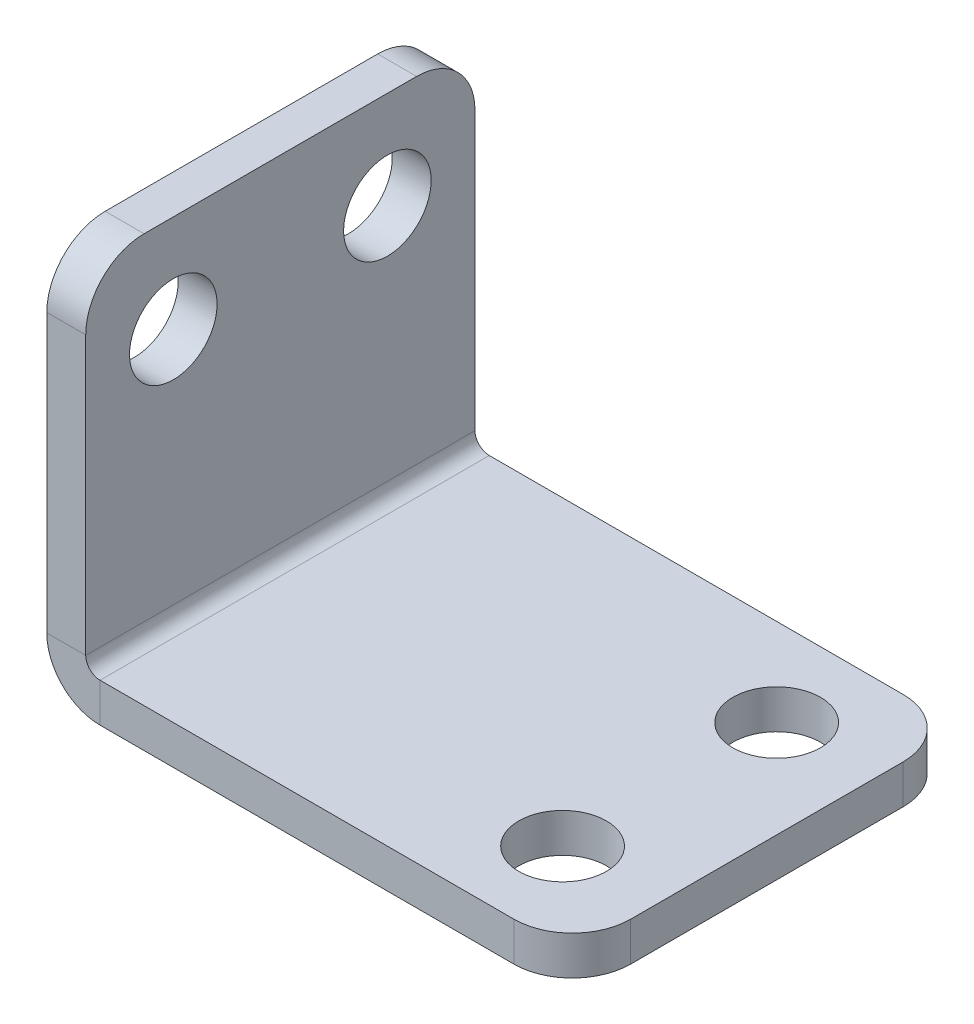
ISO-10303-21;
HEADER;
FILE_DESCRIPTION(('STEP AP214'),'2;1');
FILE_NAME('part.step','',(''),(''),'','','');
FILE_SCHEMA(('AUTOMOTIVE_DESIGN { 1 0 10303 214 1 1 1 1 }'));
ENDSEC;
DATA;
#1=APPLICATION_CONTEXT('core data for automotive mechanical design processes');
#2=APPLICATION_PROTOCOL_DEFINITION('international standard','automotive_design',2000,#1);
#3=PRODUCT_CONTEXT('',#1,'mechanical');
#4=PRODUCT('Part','Part','',(#3));
#5=PRODUCT_RELATED_PRODUCT_CATEGORY('part','',(#4));
#6=PRODUCT_DEFINITION_FORMATION('','',#4);
#7=PRODUCT_DEFINITION_CONTEXT('part definition',#1,'design');
#8=PRODUCT_DEFINITION('design','',#6,#7);
#9=PRODUCT_DEFINITION_SHAPE('','',#8);
#10=(LENGTH_UNIT() NAMED_UNIT(*) SI_UNIT(.MILLI.,.METRE.));
#11=(NAMED_UNIT(*) PLANE_ANGLE_UNIT() SI_UNIT($,.RADIAN.));
#12=(NAMED_UNIT(*) SI_UNIT($,.STERADIAN.) SOLID_ANGLE_UNIT());
#13=UNCERTAINTY_MEASURE_WITH_UNIT(LENGTH_MEASURE(1.E-05),#10,'distance_accuracy_value','');
#14=(GEOMETRIC_REPRESENTATION_CONTEXT(3) GLOBAL_UNCERTAINTY_ASSIGNED_CONTEXT((#13)) GLOBAL_UNIT_ASSIGNED_CONTEXT((#10,
#11,#12)) REPRESENTATION_CONTEXT('',''));
#15=CARTESIAN_POINT('',(0.,0.,0.));
#16=DIRECTION('',(0.,0.,1.));
#17=DIRECTION('',(1.,0.,0.));
#18=AXIS2_PLACEMENT_3D('',#15,#16,#17);
#19=CARTESIAN_POINT('',(0.,2.7366,10.));
#20=DIRECTION('',(0.,0.,1.));
#21=DIRECTION('',(1.,0.,0.));
#22=AXIS2_PLACEMENT_3D('',#19,#20,#21);
#23=PLANE('',#22);
#24=DIRECTION('',(1.,0.,0.));
#25=VECTOR('',#24,1.);
#26=CARTESIAN_POINT('',(0.,2.7366,10.));
#27=LINE('',#26,#25);
#28=CARTESIAN_POINT('',(0.,2.7366,10.));
#29=VERTEX_POINT('',#28);
#30=CARTESIAN_POINT('',(2.,2.7366,10.));
#31=VERTEX_POINT('',#30);
#32=EDGE_CURVE('E135',#29,#31,#27,.T.);
#33=ORIENTED_EDGE('',*,*,#32,.F.);
#34=CARTESIAN_POINT('',(2.7366,2.7366,10.));
#35=DIRECTION('',(0.,0.,-1.));
#36=DIRECTION('',(-1.,0.,0.));
#37=AXIS2_PLACEMENT_3D('',#34,#35,#36);
#38=CIRCLE('',#37,2.7366);
#39=CARTESIAN_POINT('',(2.7366,0.,10.));
#40=VERTEX_POINT('',#39);
#41=EDGE_CURVE('E133',#29,#40,#38,.F.);
#42=ORIENTED_EDGE('',*,*,#41,.T.);
#43=DIRECTION('',(0.,-1.,0.));
#44=VECTOR('',#43,1.);
#45=CARTESIAN_POINT('',(2.7366,2.,10.));
#46=LINE('',#45,#44);
#47=CARTESIAN_POINT('',(2.7366,2.,10.));
#48=VERTEX_POINT('',#47);
#49=EDGE_CURVE('E127',#48,#40,#46,.T.);
#50=ORIENTED_EDGE('',*,*,#49,.F.);
#51=CARTESIAN_POINT('',(2.7366,2.7366,10.));
#52=DIRECTION('',(0.,0.,1.));
#53=DIRECTION('',(1.,0.,0.));
#54=AXIS2_PLACEMENT_3D('',#51,#52,#53);
#55=CIRCLE('',#54,0.7366);
#56=EDGE_CURVE('E131',#31,#48,#55,.T.);
#57=ORIENTED_EDGE('',*,*,#56,.F.);
#58=EDGE_LOOP('',(#33,#42,#50,#57));
#59=FACE_BOUND('',#58,.T.);
#60=ADVANCED_FACE('F34',(#59),#23,.T.);
#61=CARTESIAN_POINT('',(2.7366,2.,10.));
#62=DIRECTION('',(0.,0.,1.));
#63=DIRECTION('',(1.,0.,0.));
#64=AXIS2_PLACEMENT_3D('',#61,#62,#63);
#65=PLANE('',#64);
#66=DIRECTION('',(0.,-1.,0.));
#67=VECTOR('',#66,1.);
#68=CARTESIAN_POINT('',(2.,20.,10.));
#69=LINE('',#68,#67);
#70=CARTESIAN_POINT('',(2.,17.,10.));
#71=VERTEX_POINT('',#70);
#72=EDGE_CURVE('E156',#71,#31,#69,.T.);
#73=ORIENTED_EDGE('',*,*,#72,.F.);
#74=DIRECTION('',(1.,0.,0.));
#75=VECTOR('',#74,1.);
#76=CARTESIAN_POINT('',(2.7366,17.,10.));
#77=LINE('',#76,#75);
#78=CARTESIAN_POINT('',(0.,17.,10.));
#79=VERTEX_POINT('',#78);
#80=EDGE_CURVE('E210',#71,#79,#77,.F.);
#81=ORIENTED_EDGE('',*,*,#80,.T.);
#82=DIRECTION('',(0.,-1.,0.));
#83=VECTOR('',#82,1.);
#84=CARTESIAN_POINT('',(0.,20.,10.));
#85=LINE('',#84,#83);
#86=EDGE_CURVE('E158',#79,#29,#85,.T.);
#87=ORIENTED_EDGE('',*,*,#86,.T.);
#88=ORIENTED_EDGE('',*,*,#32,.T.);
#89=EDGE_LOOP('',(#73,#81,#87,#88));
#90=FACE_BOUND('',#89,.T.);
#91=ADVANCED_FACE('F292',(#90),#65,.T.);
#92=CARTESIAN_POINT('',(2.7366,0.,-10.));
#93=DIRECTION('',(0.,0.,-1.));
#94=DIRECTION('',(-1.,0.,0.));
#95=AXIS2_PLACEMENT_3D('',#92,#93,#94);
#96=PLANE('',#95);
#97=DIRECTION('',(0.,1.,0.));
#98=VECTOR('',#97,1.);
#99=CARTESIAN_POINT('',(2.7366,0.,-10.));
#100=LINE('',#99,#98);
#101=CARTESIAN_POINT('',(2.7366,0.,-10.));
#102=VERTEX_POINT('',#101);
#103=CARTESIAN_POINT('',(2.7366,2.,-10.));
#104=VERTEX_POINT('',#103);
#105=EDGE_CURVE('E136',#102,#104,#100,.T.);
#106=ORIENTED_EDGE('',*,*,#105,.F.);
#107=CARTESIAN_POINT('',(2.7366,2.7366,-10.));
#108=DIRECTION('',(0.,0.,-1.));
#109=DIRECTION('',(-1.,0.,0.));
#110=AXIS2_PLACEMENT_3D('',#107,#108,#109);
#111=CIRCLE('',#110,2.7366);
#112=CARTESIAN_POINT('',(0.,2.7366,-10.));
#113=VERTEX_POINT('',#112);
#114=EDGE_CURVE('E176',#113,#102,#111,.F.);
#115=ORIENTED_EDGE('',*,*,#114,.F.);
#116=DIRECTION('',(-1.,0.,0.));
#117=VECTOR('',#116,1.);
#118=CARTESIAN_POINT('',(2.,2.7366,-10.));
#119=LINE('',#118,#117);
#120=CARTESIAN_POINT('',(2.,2.7366,-10.));
#121=VERTEX_POINT('',#120);
#122=EDGE_CURVE('E195',#121,#113,#119,.T.);
#123=ORIENTED_EDGE('',*,*,#122,.F.);
#124=CARTESIAN_POINT('',(2.7366,2.7366,-10.));
#125=DIRECTION('',(0.,0.,1.));
#126=DIRECTION('',(1.,0.,0.));
#127=AXIS2_PLACEMENT_3D('',#124,#125,#126);
#128=CIRCLE('',#127,0.7366);
#129=EDGE_CURVE('E170',#121,#104,#128,.T.);
#130=ORIENTED_EDGE('',*,*,#129,.T.);
#131=EDGE_LOOP('',(#106,#115,#123,#130));
#132=FACE_BOUND('',#131,.T.);
#133=ADVANCED_FACE('F297',(#132),#96,.T.);
#134=CARTESIAN_POINT('',(2.,2.7366,-10.));
#135=DIRECTION('',(0.,0.,-1.));
#136=DIRECTION('',(-1.,0.,0.));
#137=AXIS2_PLACEMENT_3D('',#134,#135,#136);
#138=PLANE('',#137);
#139=DIRECTION('',(1.,0.,0.));
#140=VECTOR('',#139,1.);
#141=CARTESIAN_POINT('',(0.,2.,-10.));
#142=LINE('',#141,#140);
#143=CARTESIAN_POINT('',(24.,2.,-10.));
#144=VERTEX_POINT('',#143);
#145=EDGE_CURVE('E143',#104,#144,#142,.T.);
#146=ORIENTED_EDGE('',*,*,#145,.T.);
#147=DIRECTION('',(0.,-1.,0.));
#148=VECTOR('',#147,1.);
#149=CARTESIAN_POINT('',(24.,2.7366,-10.));
#150=LINE('',#149,#148);
#151=CARTESIAN_POINT('',(24.,0.,-10.));
#152=VERTEX_POINT('',#151);
#153=EDGE_CURVE('E11',#144,#152,#150,.T.);
#154=ORIENTED_EDGE('',*,*,#153,.T.);
#155=DIRECTION('',(1.,0.,0.));
#156=VECTOR('',#155,1.);
#157=CARTESIAN_POINT('',(0.,0.,-10.));
#158=LINE('',#157,#156);
#159=EDGE_CURVE('E165',#102,#152,#158,.T.);
#160=ORIENTED_EDGE('',*,*,#159,.F.);
#161=ORIENTED_EDGE('',*,*,#105,.T.);
#162=EDGE_LOOP('',(#146,#154,#160,#161));
#163=FACE_BOUND('',#162,.T.);
#164=ADVANCED_FACE('F318',(#163),#138,.T.);
#165=CARTESIAN_POINT('',(0.,0.,10.));
#166=DIRECTION('',(0.,1.,0.));
#167=DIRECTION('',(0.,0.,1.));
#168=AXIS2_PLACEMENT_3D('',#165,#166,#167);
#169=PLANE('',#168);
#170=CARTESIAN_POINT('',(22.,0.,5.5));
#171=DIRECTION('',(0.,1.,0.));
#172=DIRECTION('',(0.,0.,-1.));
#173=AXIS2_PLACEMENT_3D('',#170,#171,#172);
#174=CIRCLE('',#173,2.25);
#175=CARTESIAN_POINT('',(22.,0.,3.25));
#176=VERTEX_POINT('',#175);
#177=EDGE_CURVE('E256',#176,#176,#174,.T.);
#178=ORIENTED_EDGE('',*,*,#177,.T.);
#179=EDGE_LOOP('',(#178));
#180=FACE_BOUND('',#179,.T.);
#181=CARTESIAN_POINT('',(22.,0.,-5.5));
#182=DIRECTION('',(0.,1.,0.));
#183=DIRECTION('',(0.,0.,1.));
#184=AXIS2_PLACEMENT_3D('',#181,#182,#183);
#185=CIRCLE('',#184,2.25);
#186=CARTESIAN_POINT('',(22.,0.,-3.25));
#187=VERTEX_POINT('',#186);
#188=EDGE_CURVE('E250',#187,#187,#185,.T.);
#189=ORIENTED_EDGE('',*,*,#188,.T.);
#190=EDGE_LOOP('',(#189));
#191=FACE_BOUND('',#190,.T.);
#192=DIRECTION('',(0.,0.,-1.));
#193=VECTOR('',#192,1.);
#194=CARTESIAN_POINT('',(27.,0.,10.));
#195=LINE('',#194,#193);
#196=CARTESIAN_POINT('',(27.,0.,7.));
#197=VERTEX_POINT('',#196);
#198=CARTESIAN_POINT('',(27.,0.,-7.));
#199=VERTEX_POINT('',#198);
#200=EDGE_CURVE('E192',#197,#199,#195,.T.);
#201=ORIENTED_EDGE('',*,*,#200,.F.);
#202=CARTESIAN_POINT('',(24.,0.,7.));
#203=DIRECTION('',(0.,1.,0.));
#204=DIRECTION('',(0.,0.,1.));
#205=AXIS2_PLACEMENT_3D('',#202,#203,#204);
#206=CIRCLE('',#205,3.);
#207=CARTESIAN_POINT('',(24.,0.,10.));
#208=VERTEX_POINT('',#207);
#209=EDGE_CURVE('E226',#197,#208,#206,.F.);
#210=ORIENTED_EDGE('',*,*,#209,.T.);
#211=DIRECTION('',(1.,0.,0.));
#212=VECTOR('',#211,1.);
#213=CARTESIAN_POINT('',(0.,0.,10.));
#214=LINE('',#213,#212);
#215=EDGE_CURVE('E151',#40,#208,#214,.T.);
#216=ORIENTED_EDGE('',*,*,#215,.F.);
#217=DIRECTION('',(0.,0.,-1.));
#218=VECTOR('',#217,1.);
#219=CARTESIAN_POINT('',(2.7366,0.,10.));
#220=LINE('',#219,#218);
#221=EDGE_CURVE('E164',#40,#102,#220,.T.);
#222=ORIENTED_EDGE('',*,*,#221,.T.);
#223=ORIENTED_EDGE('',*,*,#159,.T.);
#224=CARTESIAN_POINT('',(24.,0.,-7.));
#225=DIRECTION('',(0.,1.,0.));
#226=DIRECTION('',(0.,0.,1.));
#227=AXIS2_PLACEMENT_3D('',#224,#225,#226);
#228=CIRCLE('',#227,3.);
#229=EDGE_CURVE('E224',#152,#199,#228,.F.);
#230=ORIENTED_EDGE('',*,*,#229,.T.);
#231=EDGE_LOOP('',(#201,#210,#216,#222,#223,#230));
#232=FACE_BOUND('',#231,.T.);
#233=ADVANCED_FACE('F239',(#180,#191,#232),#169,.F.);
#234=CARTESIAN_POINT('',(27.,2.,10.));
#235=DIRECTION('',(1.,0.,0.));
#236=DIRECTION('',(0.,0.,-1.));
#237=AXIS2_PLACEMENT_3D('',#234,#235,#236);
#238=PLANE('',#237);
#239=DIRECTION('',(0.,0.,-1.));
#240=VECTOR('',#239,1.);
#241=CARTESIAN_POINT('',(27.,2.,10.));
#242=LINE('',#241,#240);
#243=CARTESIAN_POINT('',(27.,2.,7.));
#244=VERTEX_POINT('',#243);
#245=CARTESIAN_POINT('',(27.,2.,-7.));
#246=VERTEX_POINT('',#245);
#247=EDGE_CURVE('E147',#244,#246,#242,.T.);
#248=ORIENTED_EDGE('',*,*,#247,.F.);
#249=DIRECTION('',(0.,-1.,0.));
#250=VECTOR('',#249,1.);
#251=CARTESIAN_POINT('',(27.,2.,7.));
#252=LINE('',#251,#250);
#253=EDGE_CURVE('E221',#244,#197,#252,.T.);
#254=ORIENTED_EDGE('',*,*,#253,.T.);
#255=ORIENTED_EDGE('',*,*,#200,.T.);
#256=DIRECTION('',(0.,-1.,0.));
#257=VECTOR('',#256,1.);
#258=CARTESIAN_POINT('',(27.,2.,-7.));
#259=LINE('',#258,#257);
#260=EDGE_CURVE('E219',#199,#246,#259,.F.);
#261=ORIENTED_EDGE('',*,*,#260,.T.);
#262=EDGE_LOOP('',(#248,#254,#255,#261));
#263=FACE_BOUND('',#262,.T.);
#264=ADVANCED_FACE('F233',(#263),#238,.T.);
#265=CARTESIAN_POINT('',(0.,2.,10.));
#266=DIRECTION('',(0.,1.,0.));
#267=DIRECTION('',(0.,0.,1.));
#268=AXIS2_PLACEMENT_3D('',#265,#266,#267);
#269=PLANE('',#268);
#270=CARTESIAN_POINT('',(22.,2.,5.5));
#271=DIRECTION('',(0.,1.,0.));
#272=DIRECTION('',(0.,0.,-1.));
#273=AXIS2_PLACEMENT_3D('',#270,#271,#272);
#274=CIRCLE('',#273,2.25);
#275=CARTESIAN_POINT('',(22.,2.,3.25));
#276=VERTEX_POINT('',#275);
#277=EDGE_CURVE('E259',#276,#276,#274,.T.);
#278=ORIENTED_EDGE('',*,*,#277,.F.);
#279=EDGE_LOOP('',(#278));
#280=FACE_BOUND('',#279,.T.);
#281=CARTESIAN_POINT('',(22.,2.,-5.5));
#282=DIRECTION('',(0.,1.,0.));
#283=DIRECTION('',(0.,0.,1.));
#284=AXIS2_PLACEMENT_3D('',#281,#282,#283);
#285=CIRCLE('',#284,2.25);
#286=CARTESIAN_POINT('',(22.,2.,-3.25));
#287=VERTEX_POINT('',#286);
#288=EDGE_CURVE('E253',#287,#287,#285,.T.);
#289=ORIENTED_EDGE('',*,*,#288,.F.);
#290=EDGE_LOOP('',(#289));
#291=FACE_BOUND('',#290,.T.);
#292=DIRECTION('',(1.,0.,0.));
#293=VECTOR('',#292,1.);
#294=CARTESIAN_POINT('',(0.,2.,10.));
#295=LINE('',#294,#293);
#296=CARTESIAN_POINT('',(24.,2.,10.));
#297=VERTEX_POINT('',#296);
#298=EDGE_CURVE('E141',#48,#297,#295,.T.);
#299=ORIENTED_EDGE('',*,*,#298,.T.);
#300=CARTESIAN_POINT('',(24.,2.,7.));
#301=DIRECTION('',(0.,1.,0.));
#302=DIRECTION('',(0.,0.,1.));
#303=AXIS2_PLACEMENT_3D('',#300,#301,#302);
#304=CIRCLE('',#303,3.);
#305=EDGE_CURVE('E42',#297,#244,#304,.T.);
#306=ORIENTED_EDGE('',*,*,#305,.T.);
#307=ORIENTED_EDGE('',*,*,#247,.T.);
#308=CARTESIAN_POINT('',(24.,2.,-7.));
#309=DIRECTION('',(0.,1.,0.));
#310=DIRECTION('',(0.,0.,1.));
#311=AXIS2_PLACEMENT_3D('',#308,#309,#310);
#312=CIRCLE('',#311,3.);
#313=EDGE_CURVE('E49',#246,#144,#312,.T.);
#314=ORIENTED_EDGE('',*,*,#313,.T.);
#315=ORIENTED_EDGE('',*,*,#145,.F.);
#316=DIRECTION('',(0.,0.,-1.));
#317=VECTOR('',#316,1.);
#318=CARTESIAN_POINT('',(2.7366,2.,10.));
#319=LINE('',#318,#317);
#320=EDGE_CURVE('E139',#48,#104,#319,.T.);
#321=ORIENTED_EDGE('',*,*,#320,.F.);
#322=EDGE_LOOP('',(#299,#306,#307,#314,#315,#321));
#323=FACE_BOUND('',#322,.T.);
#324=ADVANCED_FACE('F140',(#280,#291,#323),#269,.T.);
#325=CARTESIAN_POINT('',(2.7366,2.7366,10.));
#326=DIRECTION('',(0.,0.,-1.));
#327=DIRECTION('',(-1.,0.,0.));
#328=AXIS2_PLACEMENT_3D('',#325,#326,#327);
#329=CYLINDRICAL_SURFACE('',#328,0.7366);
#330=ORIENTED_EDGE('',*,*,#129,.F.);
#331=DIRECTION('',(0.,0.,-1.));
#332=VECTOR('',#331,1.);
#333=CARTESIAN_POINT('',(2.,2.7366,10.));
#334=LINE('',#333,#332);
#335=EDGE_CURVE('E148',#31,#121,#334,.T.);
#336=ORIENTED_EDGE('',*,*,#335,.F.);
#337=ORIENTED_EDGE('',*,*,#56,.T.);
#338=ORIENTED_EDGE('',*,*,#320,.T.);
#339=EDGE_LOOP('',(#330,#336,#337,#338));
#340=FACE_BOUND('',#339,.T.);
#341=ADVANCED_FACE('F154',(#340),#329,.F.);
#342=CARTESIAN_POINT('',(2.,20.,10.));
#343=DIRECTION('',(1.,0.,0.));
#344=DIRECTION('',(0.,1.,0.));
#345=AXIS2_PLACEMENT_3D('',#342,#343,#344);
#346=PLANE('',#345);
#347=CARTESIAN_POINT('',(2.,15.,-5.5));
#348=DIRECTION('',(1.,0.,0.));
#349=DIRECTION('',(0.,-1.,0.));
#350=AXIS2_PLACEMENT_3D('',#347,#348,#349);
#351=CIRCLE('',#350,2.25);
#352=CARTESIAN_POINT('',(2.,12.75,-5.5));
#353=VERTEX_POINT('',#352);
#354=EDGE_CURVE('E247',#353,#353,#351,.T.);
#355=ORIENTED_EDGE('',*,*,#354,.F.);
#356=EDGE_LOOP('',(#355));
#357=FACE_BOUND('',#356,.T.);
#358=CARTESIAN_POINT('',(2.,15.,5.5));
#359=DIRECTION('',(1.,0.,0.));
#360=DIRECTION('',(0.,1.,0.));
#361=AXIS2_PLACEMENT_3D('',#358,#359,#360);
#362=CIRCLE('',#361,2.25);
#363=CARTESIAN_POINT('',(2.,17.25,5.5));
#364=VERTEX_POINT('',#363);
#365=EDGE_CURVE('E241',#364,#364,#362,.T.);
#366=ORIENTED_EDGE('',*,*,#365,.F.);
#367=EDGE_LOOP('',(#366));
#368=FACE_BOUND('',#367,.T.);
#369=DIRECTION('',(0.,0.,-1.));
#370=VECTOR('',#369,1.);
#371=CARTESIAN_POINT('',(2.,20.,10.));
#372=LINE('',#371,#370);
#373=CARTESIAN_POINT('',(2.,20.,7.));
#374=VERTEX_POINT('',#373);
#375=CARTESIAN_POINT('',(2.,20.,-7.));
#376=VERTEX_POINT('',#375);
#377=EDGE_CURVE('E187',#374,#376,#372,.T.);
#378=ORIENTED_EDGE('',*,*,#377,.F.);
#379=CARTESIAN_POINT('',(2.,17.,7.));
#380=DIRECTION('',(1.,0.,0.));
#381=DIRECTION('',(0.,1.,0.));
#382=AXIS2_PLACEMENT_3D('',#379,#380,#381);
#383=CIRCLE('',#382,3.);
#384=EDGE_CURVE('E208',#374,#71,#383,.T.);
#385=ORIENTED_EDGE('',*,*,#384,.T.);
#386=ORIENTED_EDGE('',*,*,#72,.T.);
#387=ORIENTED_EDGE('',*,*,#335,.T.);
#388=DIRECTION('',(0.,-1.,0.));
#389=VECTOR('',#388,1.);
#390=CARTESIAN_POINT('',(2.,20.,-10.));
#391=LINE('',#390,#389);
#392=CARTESIAN_POINT('',(2.,17.,-10.));
#393=VERTEX_POINT('',#392);
#394=EDGE_CURVE('E172',#393,#121,#391,.T.);
#395=ORIENTED_EDGE('',*,*,#394,.F.);
#396=CARTESIAN_POINT('',(2.,17.,-7.));
#397=DIRECTION('',(1.,0.,0.));
#398=DIRECTION('',(0.,1.,0.));
#399=AXIS2_PLACEMENT_3D('',#396,#397,#398);
#400=CIRCLE('',#399,3.);
#401=EDGE_CURVE('E206',#393,#376,#400,.T.);
#402=ORIENTED_EDGE('',*,*,#401,.T.);
#403=EDGE_LOOP('',(#378,#385,#386,#387,#395,#402));
#404=FACE_BOUND('',#403,.T.);
#405=ADVANCED_FACE('F330',(#357,#368,#404),#346,.T.);
#406=CARTESIAN_POINT('',(0.,20.,10.));
#407=DIRECTION('',(0.,1.,0.));
#408=DIRECTION('',(0.,0.,1.));
#409=AXIS2_PLACEMENT_3D('',#406,#407,#408);
#410=PLANE('',#409);
#411=DIRECTION('',(0.,0.,-1.));
#412=VECTOR('',#411,1.);
#413=CARTESIAN_POINT('',(0.,20.,10.));
#414=LINE('',#413,#412);
#415=CARTESIAN_POINT('',(0.,20.,7.));
#416=VERTEX_POINT('',#415);
#417=CARTESIAN_POINT('',(0.,20.,-7.));
#418=VERTEX_POINT('',#417);
#419=EDGE_CURVE('E184',#416,#418,#414,.T.);
#420=ORIENTED_EDGE('',*,*,#419,.F.);
#421=DIRECTION('',(1.,0.,0.));
#422=VECTOR('',#421,1.);
#423=CARTESIAN_POINT('',(0.,20.,7.));
#424=LINE('',#423,#422);
#425=EDGE_CURVE('E203',#416,#374,#424,.T.);
#426=ORIENTED_EDGE('',*,*,#425,.T.);
#427=ORIENTED_EDGE('',*,*,#377,.T.);
#428=DIRECTION('',(1.,0.,0.));
#429=VECTOR('',#428,1.);
#430=CARTESIAN_POINT('',(0.,20.,-7.));
#431=LINE('',#430,#429);
#432=EDGE_CURVE('E201',#376,#418,#431,.F.);
#433=ORIENTED_EDGE('',*,*,#432,.T.);
#434=EDGE_LOOP('',(#420,#426,#427,#433));
#435=FACE_BOUND('',#434,.T.);
#436=ADVANCED_FACE('F343',(#435),#410,.T.);
#437=CARTESIAN_POINT('',(0.,20.,10.));
#438=DIRECTION('',(1.,0.,0.));
#439=DIRECTION('',(0.,1.,0.));
#440=AXIS2_PLACEMENT_3D('',#437,#438,#439);
#441=PLANE('',#440);
#442=CARTESIAN_POINT('',(0.,15.,-5.5));
#443=DIRECTION('',(1.,0.,0.));
#444=DIRECTION('',(0.,-1.,0.));
#445=AXIS2_PLACEMENT_3D('',#442,#443,#444);
#446=CIRCLE('',#445,2.25);
#447=CARTESIAN_POINT('',(0.,12.75,-5.5));
#448=VERTEX_POINT('',#447);
#449=EDGE_CURVE('E244',#448,#448,#446,.T.);
#450=ORIENTED_EDGE('',*,*,#449,.T.);
#451=EDGE_LOOP('',(#450));
#452=FACE_BOUND('',#451,.T.);
#453=CARTESIAN_POINT('',(0.,15.,5.5));
#454=DIRECTION('',(1.,0.,0.));
#455=DIRECTION('',(0.,1.,0.));
#456=AXIS2_PLACEMENT_3D('',#453,#454,#455);
#457=CIRCLE('',#456,2.25);
#458=CARTESIAN_POINT('',(0.,17.25,5.5));
#459=VERTEX_POINT('',#458);
#460=EDGE_CURVE('E168',#459,#459,#457,.T.);
#461=ORIENTED_EDGE('',*,*,#460,.T.);
#462=EDGE_LOOP('',(#461));
#463=FACE_BOUND('',#462,.T.);
#464=ORIENTED_EDGE('',*,*,#86,.F.);
#465=CARTESIAN_POINT('',(0.,17.,7.));
#466=DIRECTION('',(1.,0.,0.));
#467=DIRECTION('',(0.,1.,0.));
#468=AXIS2_PLACEMENT_3D('',#465,#466,#467);
#469=CIRCLE('',#468,3.);
#470=EDGE_CURVE('E214',#79,#416,#469,.F.);
#471=ORIENTED_EDGE('',*,*,#470,.T.);
#472=ORIENTED_EDGE('',*,*,#419,.T.);
#473=CARTESIAN_POINT('',(0.,17.,-7.));
#474=DIRECTION('',(1.,0.,0.));
#475=DIRECTION('',(0.,1.,0.));
#476=AXIS2_PLACEMENT_3D('',#473,#474,#475);
#477=CIRCLE('',#476,3.);
#478=CARTESIAN_POINT('',(0.,17.,-10.));
#479=VERTEX_POINT('',#478);
#480=EDGE_CURVE('E212',#418,#479,#477,.F.);
#481=ORIENTED_EDGE('',*,*,#480,.T.);
#482=DIRECTION('',(0.,-1.,0.));
#483=VECTOR('',#482,1.);
#484=CARTESIAN_POINT('',(0.,20.,-10.));
#485=LINE('',#484,#483);
#486=EDGE_CURVE('E174',#479,#113,#485,.T.);
#487=ORIENTED_EDGE('',*,*,#486,.T.);
#488=DIRECTION('',(0.,0.,-1.));
#489=VECTOR('',#488,1.);
#490=CARTESIAN_POINT('',(0.,2.7366,10.));
#491=LINE('',#490,#489);
#492=EDGE_CURVE('E181',#29,#113,#491,.T.);
#493=ORIENTED_EDGE('',*,*,#492,.F.);
#494=EDGE_LOOP('',(#464,#471,#472,#481,#487,#493));
#495=FACE_BOUND('',#494,.T.);
#496=ADVANCED_FACE('F335',(#452,#463,#495),#441,.F.);
#497=CARTESIAN_POINT('',(2.7366,2.7366,10.));
#498=DIRECTION('',(0.,0.,-1.));
#499=DIRECTION('',(-1.,0.,0.));
#500=AXIS2_PLACEMENT_3D('',#497,#498,#499);
#501=CYLINDRICAL_SURFACE('',#500,2.7366);
#502=ORIENTED_EDGE('',*,*,#114,.T.);
#503=ORIENTED_EDGE('',*,*,#221,.F.);
#504=ORIENTED_EDGE('',*,*,#41,.F.);
#505=ORIENTED_EDGE('',*,*,#492,.T.);
#506=EDGE_LOOP('',(#502,#503,#504,#505));
#507=FACE_BOUND('',#506,.T.);
#508=ADVANCED_FACE('F320',(#507),#501,.T.);
#509=CARTESIAN_POINT('',(2.7366,2.7366,10.));
#510=DIRECTION('',(0.,0.,1.));
#511=DIRECTION('',(1.,0.,0.));
#512=AXIS2_PLACEMENT_3D('',#509,#510,#511);
#513=PLANE('',#512);
#514=ORIENTED_EDGE('',*,*,#215,.T.);
#515=DIRECTION('',(0.,-1.,0.));
#516=VECTOR('',#515,1.);
#517=CARTESIAN_POINT('',(24.,2.7366,10.));
#518=LINE('',#517,#516);
#519=EDGE_CURVE('E57',#208,#297,#518,.F.);
#520=ORIENTED_EDGE('',*,*,#519,.T.);
#521=ORIENTED_EDGE('',*,*,#298,.F.);
#522=ORIENTED_EDGE('',*,*,#49,.T.);
#523=EDGE_LOOP('',(#514,#520,#521,#522));
#524=FACE_BOUND('',#523,.T.);
#525=ADVANCED_FACE('F150',(#524),#513,.T.);
#526=CARTESIAN_POINT('',(2.7366,2.7366,-10.));
#527=DIRECTION('',(0.,0.,1.));
#528=DIRECTION('',(1.,0.,0.));
#529=AXIS2_PLACEMENT_3D('',#526,#527,#528);
#530=PLANE('',#529);
#531=ORIENTED_EDGE('',*,*,#486,.F.);
#532=DIRECTION('',(1.,0.,0.));
#533=VECTOR('',#532,1.);
#534=CARTESIAN_POINT('',(2.,17.,-10.));
#535=LINE('',#534,#533);
#536=EDGE_CURVE('E216',#479,#393,#535,.T.);
#537=ORIENTED_EDGE('',*,*,#536,.T.);
#538=ORIENTED_EDGE('',*,*,#394,.T.);
#539=ORIENTED_EDGE('',*,*,#122,.T.);
#540=EDGE_LOOP('',(#531,#537,#538,#539));
#541=FACE_BOUND('',#540,.T.);
#542=ADVANCED_FACE('F339',(#541),#530,.F.);
#543=CARTESIAN_POINT('',(0.,15.,5.5));
#544=DIRECTION('',(1.,0.,0.));
#545=DIRECTION('',(0.,1.,0.));
#546=AXIS2_PLACEMENT_3D('',#543,#544,#545);
#547=CYLINDRICAL_SURFACE('',#546,2.25);
#548=ORIENTED_EDGE('',*,*,#460,.F.);
#549=EDGE_LOOP('',(#548));
#550=FACE_BOUND('',#549,.T.);
#551=ORIENTED_EDGE('',*,*,#365,.T.);
#552=EDGE_LOOP('',(#551));
#553=FACE_BOUND('',#552,.T.);
#554=ADVANCED_FACE('F287',(#550,#553),#547,.F.);
#555=CARTESIAN_POINT('',(0.,15.,-5.5));
#556=DIRECTION('',(1.,0.,0.));
#557=DIRECTION('',(0.,1.,0.));
#558=AXIS2_PLACEMENT_3D('',#555,#556,#557);
#559=CYLINDRICAL_SURFACE('',#558,2.25);
#560=ORIENTED_EDGE('',*,*,#449,.F.);
#561=EDGE_LOOP('',(#560));
#562=FACE_BOUND('',#561,.T.);
#563=ORIENTED_EDGE('',*,*,#354,.T.);
#564=EDGE_LOOP('',(#563));
#565=FACE_BOUND('',#564,.T.);
#566=ADVANCED_FACE('F281',(#562,#565),#559,.F.);
#567=CARTESIAN_POINT('',(22.,0.,-5.5));
#568=DIRECTION('',(0.,1.,0.));
#569=DIRECTION('',(0.,0.,1.));
#570=AXIS2_PLACEMENT_3D('',#567,#568,#569);
#571=CYLINDRICAL_SURFACE('',#570,2.25);
#572=ORIENTED_EDGE('',*,*,#188,.F.);
#573=EDGE_LOOP('',(#572));
#574=FACE_BOUND('',#573,.T.);
#575=ORIENTED_EDGE('',*,*,#288,.T.);
#576=EDGE_LOOP('',(#575));
#577=FACE_BOUND('',#576,.T.);
#578=ADVANCED_FACE('F271',(#574,#577),#571,.F.);
#579=CARTESIAN_POINT('',(22.,0.,5.5));
#580=DIRECTION('',(0.,1.,0.));
#581=DIRECTION('',(0.,0.,1.));
#582=AXIS2_PLACEMENT_3D('',#579,#580,#581);
#583=CYLINDRICAL_SURFACE('',#582,2.25);
#584=ORIENTED_EDGE('',*,*,#177,.F.);
#585=EDGE_LOOP('',(#584));
#586=FACE_BOUND('',#585,.T.);
#587=ORIENTED_EDGE('',*,*,#277,.T.);
#588=EDGE_LOOP('',(#587));
#589=FACE_BOUND('',#588,.T.);
#590=ADVANCED_FACE('F267',(#586,#589),#583,.F.);
#591=CARTESIAN_POINT('',(0.,17.,7.));
#592=DIRECTION('',(1.,0.,0.));
#593=DIRECTION('',(0.,0.,-1.));
#594=AXIS2_PLACEMENT_3D('',#591,#592,#593);
#595=CYLINDRICAL_SURFACE('',#594,3.);
#596=ORIENTED_EDGE('',*,*,#470,.F.);
#597=ORIENTED_EDGE('',*,*,#80,.F.);
#598=ORIENTED_EDGE('',*,*,#384,.F.);
#599=ORIENTED_EDGE('',*,*,#425,.F.);
#600=EDGE_LOOP('',(#596,#597,#598,#599));
#601=FACE_BOUND('',#600,.T.);
#602=ADVANCED_FACE('F270',(#601),#595,.T.);
#603=CARTESIAN_POINT('',(2.7366,17.,-7.));
#604=DIRECTION('',(-1.,0.,0.));
#605=DIRECTION('',(0.,0.,1.));
#606=AXIS2_PLACEMENT_3D('',#603,#604,#605);
#607=CYLINDRICAL_SURFACE('',#606,3.);
#608=ORIENTED_EDGE('',*,*,#480,.F.);
#609=ORIENTED_EDGE('',*,*,#432,.F.);
#610=ORIENTED_EDGE('',*,*,#401,.F.);
#611=ORIENTED_EDGE('',*,*,#536,.F.);
#612=EDGE_LOOP('',(#608,#609,#610,#611));
#613=FACE_BOUND('',#612,.T.);
#614=ADVANCED_FACE('F304',(#613),#607,.T.);
#615=CARTESIAN_POINT('',(24.,2.,7.));
#616=DIRECTION('',(0.,-1.,0.));
#617=DIRECTION('',(0.,0.,-1.));
#618=AXIS2_PLACEMENT_3D('',#615,#616,#617);
#619=CYLINDRICAL_SURFACE('',#618,3.);
#620=ORIENTED_EDGE('',*,*,#305,.F.);
#621=ORIENTED_EDGE('',*,*,#519,.F.);
#622=ORIENTED_EDGE('',*,*,#209,.F.);
#623=ORIENTED_EDGE('',*,*,#253,.F.);
#624=EDGE_LOOP('',(#620,#621,#622,#623));
#625=FACE_BOUND('',#624,.T.);
#626=ADVANCED_FACE('F236',(#625),#619,.T.);
#627=CARTESIAN_POINT('',(24.,2.7366,-7.));
#628=DIRECTION('',(0.,-1.,0.));
#629=DIRECTION('',(0.,0.,-1.));
#630=AXIS2_PLACEMENT_3D('',#627,#628,#629);
#631=CYLINDRICAL_SURFACE('',#630,3.);
#632=ORIENTED_EDGE('',*,*,#313,.F.);
#633=ORIENTED_EDGE('',*,*,#260,.F.);
#634=ORIENTED_EDGE('',*,*,#229,.F.);
#635=ORIENTED_EDGE('',*,*,#153,.F.);
#636=EDGE_LOOP('',(#632,#633,#634,#635));
#637=FACE_BOUND('',#636,.T.);
#638=ADVANCED_FACE('F36',(#637),#631,.T.);
#639=CLOSED_SHELL('',(#60,#91,#133,#164,#233,#264,#324,#341,#405,#436,#496,#508,#525,#542,#554,
#566,#578,#590,#602,#614,#626,#638));
#640=MANIFOLD_SOLID_BREP('B2',#639);
#641=ADVANCED_BREP_SHAPE_REPRESENTATION('',(#18,#640),#14);
#642=SHAPE_DEFINITION_REPRESENTATION(#9,#641);
ENDSEC;
END-ISO-10303-21;
